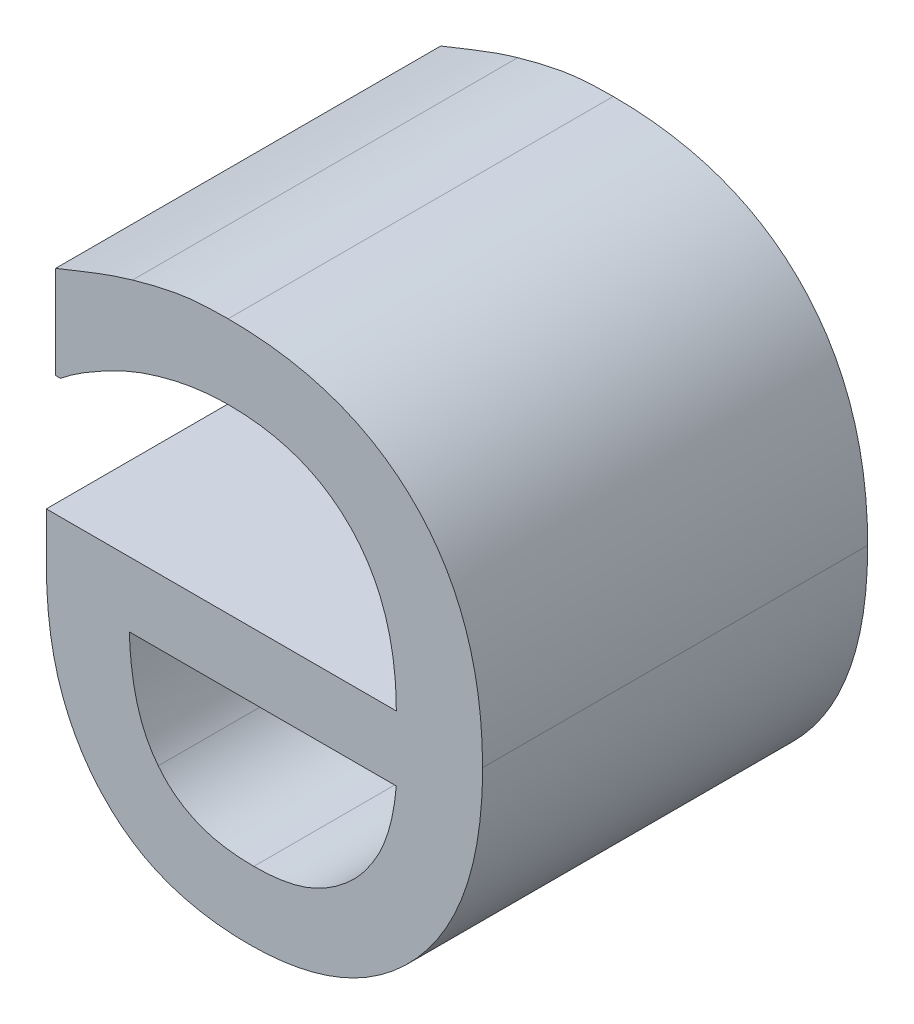
ISO-10303-21;
HEADER;
FILE_DESCRIPTION(('STEP AP214'),'2;1');
FILE_NAME('part.step','',(''),(''),'','','');
FILE_SCHEMA(('AUTOMOTIVE_DESIGN { 1 0 10303 214 1 1 1 1 }'));
ENDSEC;
DATA;
#1=APPLICATION_CONTEXT('core data for automotive mechanical design processes');
#2=APPLICATION_PROTOCOL_DEFINITION('international standard','automotive_design',2000,#1);
#3=PRODUCT_CONTEXT('',#1,'mechanical');
#4=PRODUCT('Part','Part','',(#3));
#5=PRODUCT_RELATED_PRODUCT_CATEGORY('part','',(#4));
#6=PRODUCT_DEFINITION_FORMATION('','',#4);
#7=PRODUCT_DEFINITION_CONTEXT('part definition',#1,'design');
#8=PRODUCT_DEFINITION('design','',#6,#7);
#9=PRODUCT_DEFINITION_SHAPE('','',#8);
#10=(LENGTH_UNIT() NAMED_UNIT(*) SI_UNIT(.MILLI.,.METRE.));
#11=(NAMED_UNIT(*) PLANE_ANGLE_UNIT() SI_UNIT($,.RADIAN.));
#12=(NAMED_UNIT(*) SI_UNIT($,.STERADIAN.) SOLID_ANGLE_UNIT());
#13=UNCERTAINTY_MEASURE_WITH_UNIT(LENGTH_MEASURE(1.E-05),#10,'distance_accuracy_value','');
#14=(GEOMETRIC_REPRESENTATION_CONTEXT(3) GLOBAL_UNCERTAINTY_ASSIGNED_CONTEXT((#13)) GLOBAL_UNIT_ASSIGNED_CONTEXT((#10,
#11,#12)) REPRESENTATION_CONTEXT('',''));
#15=CARTESIAN_POINT('',(0.,0.,0.));
#16=DIRECTION('',(0.,0.,1.));
#17=DIRECTION('',(1.,0.,0.));
#18=AXIS2_PLACEMENT_3D('',#15,#16,#17);
#19=CARTESIAN_POINT('',(6.0650370132147,1.5738883597151,0.));
#20=DIRECTION('',(0.,1.,0.));
#21=DIRECTION('',(-1.,0.,0.));
#22=AXIS2_PLACEMENT_3D('',#19,#20,#21);
#23=PLANE('',#22);
#24=DIRECTION('',(-1.,0.,0.));
#25=VECTOR('',#24,1.);
#26=CARTESIAN_POINT('',(6.0465221331064,1.5738883597151,0.));
#27=LINE('',#26,#25);
#28=CARTESIAN_POINT('',(6.0650370132147,1.5738883597151,0.));
#29=VERTEX_POINT('',#28);
#30=CARTESIAN_POINT('',(5.995705210322,1.5738883597151,0.));
#31=VERTEX_POINT('',#30);
#32=EDGE_CURVE('E11',#29,#31,#27,.T.);
#33=ORIENTED_EDGE('',*,*,#32,.F.);
#34=DIRECTION('',(0.,0.,1.));
#35=VECTOR('',#34,1.);
#36=CARTESIAN_POINT('',(6.0650370132147,1.5738883597151,0.));
#37=LINE('',#36,#35);
#38=CARTESIAN_POINT('',(6.0650370132147,1.5738883597151,0.1));
#39=VERTEX_POINT('',#38);
#40=EDGE_CURVE('E24',#29,#39,#37,.T.);
#41=ORIENTED_EDGE('',*,*,#40,.T.);
#42=DIRECTION('',(1.,0.,0.));
#43=VECTOR('',#42,1.);
#44=CARTESIAN_POINT('',(6.0465221331064,1.5738883597151,0.1));
#45=LINE('',#44,#43);
#46=CARTESIAN_POINT('',(5.995705210322,1.5738883597151,0.1));
#47=VERTEX_POINT('',#46);
#48=EDGE_CURVE('E414',#47,#39,#45,.T.);
#49=ORIENTED_EDGE('',*,*,#48,.F.);
#50=DIRECTION('',(0.,0.,1.));
#51=VECTOR('',#50,1.);
#52=CARTESIAN_POINT('',(5.995705210322,1.5738883597151,0.));
#53=LINE('',#52,#51);
#54=EDGE_CURVE('E408',#31,#47,#53,.T.);
#55=ORIENTED_EDGE('',*,*,#54,.F.);
#56=EDGE_LOOP('',(#33,#41,#49,#55));
#57=FACE_BOUND('',#56,.T.);
#58=ADVANCED_FACE('F17',(#57),#23,.F.);
#59=CARTESIAN_POINT('',(6.0542615182866,1.5476585365349,0.));
#60=CARTESIAN_POINT('',(6.0542615182866,1.5476585365349,0.1));
#61=CARTESIAN_POINT('',(6.0592239172666,1.5529045011709,0.));
#62=CARTESIAN_POINT('',(6.0592239172666,1.5529045011709,0.1));
#63=CARTESIAN_POINT('',(6.0643280990747,1.565523172863,0.));
#64=CARTESIAN_POINT('',(6.0643280990747,1.565523172863,0.1));
#65=CARTESIAN_POINT('',(6.0650370132147,1.5738883597151,0.));
#66=CARTESIAN_POINT('',(6.0650370132147,1.5738883597151,0.1));
#67=B_SPLINE_SURFACE_WITH_KNOTS('',2,1,((#59,#60),(#61,#62),(#63,#64),(#65,#66)),.UNSPECIFIED.,
.F.,.F.,.F.,(3,1,3),(2,2),(0.,1.,2.),(0.,0.01),.UNSPECIFIED.);
#68=CARTESIAN_POINT('',(6.0542615182866,1.5476585365349,0.));
#69=CARTESIAN_POINT('',(6.0592239172666,1.5529045011709,0.));
#70=CARTESIAN_POINT('',(6.0643280990747,1.565523172863,0.));
#71=CARTESIAN_POINT('',(6.0650370132147,1.5738883597151,0.));
#72=B_SPLINE_CURVE_WITH_KNOTS('',2,(#68,#69,#70,#71),.UNSPECIFIED.,.F.,.F.,(3,1,3),(0.,1.,2.),.UNSPECIFIED.);
#73=CARTESIAN_POINT('',(6.0542615182866,1.5476585365349,0.));
#74=VERTEX_POINT('',#73);
#75=EDGE_CURVE('E404',#74,#29,#72,.T.);
#76=DIRECTION('',(0.,0.,1.));
#77=VECTOR('',#76,1.);
#78=CARTESIAN_POINT('',(6.0542615182866,1.5476585365349,0.));
#79=LINE('',#78,#77);
#80=CARTESIAN_POINT('',(6.0542615182866,1.5476585365349,0.1));
#81=VERTEX_POINT('',#80);
#82=EDGE_CURVE('E398',#74,#81,#79,.T.);
#83=CARTESIAN_POINT('',(6.0650370132147,1.5738883597151,0.1));
#84=CARTESIAN_POINT('',(6.0643280990747,1.565523172863,0.1));
#85=CARTESIAN_POINT('',(6.0592239172666,1.5529045011709,0.1));
#86=CARTESIAN_POINT('',(6.0542615182866,1.5476585365349,0.1));
#87=B_SPLINE_CURVE_WITH_KNOTS('',2,(#83,#84,#85,#86),.UNSPECIFIED.,.F.,.F.,(3,1,3),(-2.,-1.,0.),.UNSPECIFIED.);
#88=EDGE_CURVE('E391',#39,#81,#87,.T.);
#89=ORIENTED_EDGE('',*,*,#75,.F.);
#90=ORIENTED_EDGE('',*,*,#82,.T.);
#91=ORIENTED_EDGE('',*,*,#88,.F.);
#92=ORIENTED_EDGE('',*,*,#40,.F.);
#93=EDGE_LOOP('',(#89,#90,#91,#92));
#94=FACE_BOUND('',#93,.T.);
#95=ADVANCED_FACE('F420',(#94),#67,.F.);
#96=CARTESIAN_POINT('',(6.0280316951063,1.5373083900908,0.));
#97=CARTESIAN_POINT('',(6.0280316951063,1.5373083900908,0.1));
#98=CARTESIAN_POINT('',(6.0368222304424,1.5373083900908,0.));
#99=CARTESIAN_POINT('',(6.0368222304424,1.5373083900908,0.1));
#100=CARTESIAN_POINT('',(6.0491573364785,1.5425543547268,0.));
#101=CARTESIAN_POINT('',(6.0491573364785,1.5425543547268,0.1));
#102=CARTESIAN_POINT('',(6.0542615182866,1.5476585365349,0.));
#103=CARTESIAN_POINT('',(6.0542615182866,1.5476585365349,0.1));
#104=B_SPLINE_SURFACE_WITH_KNOTS('',2,1,((#96,#97),(#98,#99),(#100,#101),(#102,#103)),
.UNSPECIFIED.,.F.,.F.,.F.,(3,1,3),(2,2),(0.,1.,2.),(0.,0.01),.UNSPECIFIED.);
#105=CARTESIAN_POINT('',(6.0280316951063,1.5373083900908,0.));
#106=CARTESIAN_POINT('',(6.0368222304424,1.5373083900908,0.));
#107=CARTESIAN_POINT('',(6.0491573364785,1.5425543547268,0.));
#108=CARTESIAN_POINT('',(6.0542615182866,1.5476585365349,0.));
#109=B_SPLINE_CURVE_WITH_KNOTS('',2,(#105,#106,#107,#108),.UNSPECIFIED.,.F.,.F.,(3,1,3),(0.,1.,
2.),.UNSPECIFIED.);
#110=CARTESIAN_POINT('',(6.0280316951063,1.5373083900908,0.));
#111=VERTEX_POINT('',#110);
#112=EDGE_CURVE('E386',#111,#74,#109,.T.);
#113=DIRECTION('',(0.,0.,1.));
#114=VECTOR('',#113,1.);
#115=CARTESIAN_POINT('',(6.0280316951063,1.5373083900908,0.));
#116=LINE('',#115,#114);
#117=CARTESIAN_POINT('',(6.0280316951063,1.5373083900908,0.1));
#118=VERTEX_POINT('',#117);
#119=EDGE_CURVE('E380',#111,#118,#116,.T.);
#120=CARTESIAN_POINT('',(6.0542615182866,1.5476585365349,0.1));
#121=CARTESIAN_POINT('',(6.0491573364785,1.5425543547268,0.1));
#122=CARTESIAN_POINT('',(6.0368222304424,1.5373083900908,0.1));
#123=CARTESIAN_POINT('',(6.0280316951063,1.5373083900908,0.1));
#124=B_SPLINE_CURVE_WITH_KNOTS('',2,(#120,#121,#122,#123),.UNSPECIFIED.,.F.,.F.,(3,1,3),(-2.,
-1.,0.),.UNSPECIFIED.);
#125=EDGE_CURVE('E373',#81,#118,#124,.T.);
#126=ORIENTED_EDGE('',*,*,#112,.F.);
#127=ORIENTED_EDGE('',*,*,#119,.T.);
#128=ORIENTED_EDGE('',*,*,#125,.F.);
#129=ORIENTED_EDGE('',*,*,#82,.F.);
#130=EDGE_LOOP('',(#126,#127,#128,#129));
#131=FACE_BOUND('',#130,.T.);
#132=ADVANCED_FACE('F424',(#131),#104,.F.);
#133=CARTESIAN_POINT('',(6.0032197002061,1.5475167537068,0.));
#134=CARTESIAN_POINT('',(6.0032197002061,1.5475167537068,0.1));
#135=CARTESIAN_POINT('',(6.0070478365621,1.5425543547268,0.));
#136=CARTESIAN_POINT('',(6.0070478365621,1.5425543547268,0.1));
#137=CARTESIAN_POINT('',(6.0190993769422,1.5373083900908,0.));
#138=CARTESIAN_POINT('',(6.0190993769422,1.5373083900908,0.1));
#139=CARTESIAN_POINT('',(6.0280316951063,1.5373083900908,0.));
#140=CARTESIAN_POINT('',(6.0280316951063,1.5373083900908,0.1));
#141=B_SPLINE_SURFACE_WITH_KNOTS('',2,1,((#133,#134),(#135,#136),(#137,#138),(#139,#140)),
.UNSPECIFIED.,.F.,.F.,.F.,(3,1,3),(2,2),(0.,1.,2.),(0.,0.01),.UNSPECIFIED.);
#142=CARTESIAN_POINT('',(6.0032197002061,1.5475167537068,0.));
#143=CARTESIAN_POINT('',(6.0070478365621,1.5425543547268,0.));
#144=CARTESIAN_POINT('',(6.0190993769422,1.5373083900908,0.));
#145=CARTESIAN_POINT('',(6.0280316951063,1.5373083900908,0.));
#146=B_SPLINE_CURVE_WITH_KNOTS('',2,(#142,#143,#144,#145),.UNSPECIFIED.,.F.,.F.,(3,1,3),(0.,1.,
2.),.UNSPECIFIED.);
#147=CARTESIAN_POINT('',(6.0032197002061,1.5475167537068,0.));
#148=VERTEX_POINT('',#147);
#149=EDGE_CURVE('E368',#148,#111,#146,.T.);
#150=DIRECTION('',(0.,0.,1.));
#151=VECTOR('',#150,1.);
#152=CARTESIAN_POINT('',(6.0032197002061,1.5475167537068,0.));
#153=LINE('',#152,#151);
#154=CARTESIAN_POINT('',(6.0032197002061,1.5475167537068,0.1));
#155=VERTEX_POINT('',#154);
#156=EDGE_CURVE('E362',#148,#155,#153,.T.);
#157=CARTESIAN_POINT('',(6.0280316951063,1.5373083900908,0.1));
#158=CARTESIAN_POINT('',(6.0190993769422,1.5373083900908,0.1));
#159=CARTESIAN_POINT('',(6.0070478365621,1.5425543547268,0.1));
#160=CARTESIAN_POINT('',(6.0032197002061,1.5475167537068,0.1));
#161=B_SPLINE_CURVE_WITH_KNOTS('',2,(#157,#158,#159,#160),.UNSPECIFIED.,.F.,.F.,(3,1,3),(-2.,
-1.,0.),.UNSPECIFIED.);
#162=EDGE_CURVE('E355',#118,#155,#161,.T.);
#163=ORIENTED_EDGE('',*,*,#149,.F.);
#164=ORIENTED_EDGE('',*,*,#156,.T.);
#165=ORIENTED_EDGE('',*,*,#162,.F.);
#166=ORIENTED_EDGE('',*,*,#119,.F.);
#167=EDGE_LOOP('',(#163,#164,#165,#166));
#168=FACE_BOUND('',#167,.T.);
#169=ADVANCED_FACE('F428',(#168),#141,.F.);
#170=CARTESIAN_POINT('',(5.995705210322,1.5738883597151,0.));
#171=CARTESIAN_POINT('',(5.995705210322,1.5738883597151,0.1));
#172=CARTESIAN_POINT('',(5.995988775978,1.564956041551,0.));
#173=CARTESIAN_POINT('',(5.995988775978,1.564956041551,0.1));
#174=CARTESIAN_POINT('',(5.999675129506,1.5519120213749,0.));
#175=CARTESIAN_POINT('',(5.999675129506,1.5519120213749,0.1));
#176=CARTESIAN_POINT('',(6.0032197002061,1.5475167537068,0.));
#177=CARTESIAN_POINT('',(6.0032197002061,1.5475167537068,0.1));
#178=B_SPLINE_SURFACE_WITH_KNOTS('',2,1,((#170,#171),(#172,#173),(#174,#175),(#176,#177)),
.UNSPECIFIED.,.F.,.F.,.F.,(3,1,3),(2,2),(0.,1.,2.),(0.,0.01),.UNSPECIFIED.);
#179=CARTESIAN_POINT('',(5.995705210322,1.5738883597151,0.));
#180=CARTESIAN_POINT('',(5.995988775978,1.564956041551,0.));
#181=CARTESIAN_POINT('',(5.999675129506,1.5519120213749,0.));
#182=CARTESIAN_POINT('',(6.0032197002061,1.5475167537068,0.));
#183=B_SPLINE_CURVE_WITH_KNOTS('',2,(#179,#180,#181,#182),.UNSPECIFIED.,.F.,.F.,(3,1,3),(0.,1.,
2.),.UNSPECIFIED.);
#184=EDGE_CURVE('E348',#31,#148,#183,.T.);
#185=CARTESIAN_POINT('',(6.0032197002061,1.5475167537068,0.1));
#186=CARTESIAN_POINT('',(5.999675129506,1.5519120213749,0.1));
#187=CARTESIAN_POINT('',(5.995988775978,1.564956041551,0.1));
#188=CARTESIAN_POINT('',(5.995705210322,1.5738883597151,0.1));
#189=B_SPLINE_CURVE_WITH_KNOTS('',2,(#185,#186,#187,#188),.UNSPECIFIED.,.F.,.F.,(3,1,3),(-2.,
-1.,0.),.UNSPECIFIED.);
#190=EDGE_CURVE('E340',#155,#47,#189,.T.);
#191=ORIENTED_EDGE('',*,*,#184,.F.);
#192=ORIENTED_EDGE('',*,*,#54,.T.);
#193=ORIENTED_EDGE('',*,*,#190,.F.);
#194=ORIENTED_EDGE('',*,*,#156,.F.);
#195=EDGE_LOOP('',(#191,#192,#193,#194));
#196=FACE_BOUND('',#195,.T.);
#197=ADVANCED_FACE('F431',(#196),#178,.F.);
#198=CARTESIAN_POINT('',(6.0267556496543,1.5191601881066,0.));
#199=CARTESIAN_POINT('',(6.0267556496543,1.5191601881066,0.1));
#200=CARTESIAN_POINT('',(6.0538361698026,1.5191601881066,0.));
#201=CARTESIAN_POINT('',(6.0538361698026,1.5191601881066,0.1));
#202=CARTESIAN_POINT('',(6.0874387000389,1.5571579860109,0.));
#203=CARTESIAN_POINT('',(6.0874387000389,1.5571579860109,0.1));
#204=CARTESIAN_POINT('',(6.0874387000389,1.5892009051393,0.));
#205=CARTESIAN_POINT('',(6.0874387000389,1.5892009051393,0.1));
#206=B_SPLINE_SURFACE_WITH_KNOTS('',2,1,((#198,#199),(#200,#201),(#202,#203),(#204,#205)),
.UNSPECIFIED.,.F.,.F.,.F.,(3,1,3),(2,2),(-2.,-1.,0.),(0.,0.01),.UNSPECIFIED.);
#207=CARTESIAN_POINT('',(6.0874387000389,1.5892009051393,0.));
#208=CARTESIAN_POINT('',(6.0874387000389,1.5571579860109,0.));
#209=CARTESIAN_POINT('',(6.0538361698026,1.5191601881066,0.));
#210=CARTESIAN_POINT('',(6.0267556496543,1.5191601881066,0.));
#211=B_SPLINE_CURVE_WITH_KNOTS('',2,(#207,#208,#209,#210),.UNSPECIFIED.,.F.,.F.,(3,1,3),(0.,1.,
2.),.UNSPECIFIED.);
#212=CARTESIAN_POINT('',(6.0874387000389,1.5892009051393,0.));
#213=VERTEX_POINT('',#212);
#214=CARTESIAN_POINT('',(6.0267556496543,1.5191601881066,0.));
#215=VERTEX_POINT('',#214);
#216=EDGE_CURVE('E336',#213,#215,#211,.T.);
#217=DIRECTION('',(0.,0.,1.));
#218=VECTOR('',#217,1.);
#219=CARTESIAN_POINT('',(6.0874387000389,1.5892009051393,0.));
#220=LINE('',#219,#218);
#221=CARTESIAN_POINT('',(6.0874387000389,1.5892009051393,0.1));
#222=VERTEX_POINT('',#221);
#223=EDGE_CURVE('E331',#213,#222,#220,.T.);
#224=CARTESIAN_POINT('',(6.0267556496543,1.5191601881066,0.1));
#225=CARTESIAN_POINT('',(6.0538361698026,1.5191601881066,0.1));
#226=CARTESIAN_POINT('',(6.0874387000389,1.5571579860109,0.1));
#227=CARTESIAN_POINT('',(6.0874387000389,1.5892009051393,0.1));
#228=B_SPLINE_CURVE_WITH_KNOTS('',2,(#224,#225,#226,#227),.UNSPECIFIED.,.F.,.F.,(3,1,3),(-2.,
-1.,0.),.UNSPECIFIED.);
#229=CARTESIAN_POINT('',(6.0267556496543,1.5191601881066,0.1));
#230=VERTEX_POINT('',#229);
#231=EDGE_CURVE('E164',#230,#222,#228,.T.);
#232=DIRECTION('',(0.,0.,1.));
#233=VECTOR('',#232,1.);
#234=CARTESIAN_POINT('',(6.0267556496543,1.5191601881066,0.));
#235=LINE('',#234,#233);
#236=EDGE_CURVE('E322',#215,#230,#235,.T.);
#237=ORIENTED_EDGE('',*,*,#216,.F.);
#238=ORIENTED_EDGE('',*,*,#223,.T.);
#239=ORIENTED_EDGE('',*,*,#231,.F.);
#240=ORIENTED_EDGE('',*,*,#236,.F.);
#241=EDGE_LOOP('',(#237,#238,#239,#240));
#242=FACE_BOUND('',#241,.T.);
#243=ADVANCED_FACE('F479',(#242),#206,.T.);
#244=CARTESIAN_POINT('',(5.9887578517499,1.5337638193907,0.));
#245=CARTESIAN_POINT('',(5.9887578517499,1.5337638193907,0.1));
#246=CARTESIAN_POINT('',(5.995705210322,1.5262493295066,0.));
#247=CARTESIAN_POINT('',(5.995705210322,1.5262493295066,0.1));
#248=CARTESIAN_POINT('',(6.0145623264462,1.5191601881066,0.));
#249=CARTESIAN_POINT('',(6.0145623264462,1.5191601881066,0.1));
#250=CARTESIAN_POINT('',(6.0267556496543,1.5191601881066,0.));
#251=CARTESIAN_POINT('',(6.0267556496543,1.5191601881066,0.1));
#252=B_SPLINE_SURFACE_WITH_KNOTS('',2,1,((#244,#245),(#246,#247),(#248,#249),(#250,#251)),
.UNSPECIFIED.,.F.,.F.,.F.,(3,1,3),(2,2),(-2.,-1.,0.),(0.,0.01),.UNSPECIFIED.);
#253=CARTESIAN_POINT('',(6.0267556496543,1.5191601881066,0.));
#254=CARTESIAN_POINT('',(6.0145623264462,1.5191601881066,0.));
#255=CARTESIAN_POINT('',(5.995705210322,1.5262493295066,0.));
#256=CARTESIAN_POINT('',(5.9887578517499,1.5337638193907,0.));
#257=B_SPLINE_CURVE_WITH_KNOTS('',2,(#253,#254,#255,#256),.UNSPECIFIED.,.F.,.F.,(3,1,3),(0.,1.,
2.),.UNSPECIFIED.);
#258=CARTESIAN_POINT('',(5.9887578517499,1.5337638193907,0.));
#259=VERTEX_POINT('',#258);
#260=EDGE_CURVE('E315',#215,#259,#257,.T.);
#261=CARTESIAN_POINT('',(5.9887578517499,1.5337638193907,0.1));
#262=CARTESIAN_POINT('',(5.995705210322,1.5262493295066,0.1));
#263=CARTESIAN_POINT('',(6.0145623264462,1.5191601881066,0.1));
#264=CARTESIAN_POINT('',(6.0267556496543,1.5191601881066,0.1));
#265=B_SPLINE_CURVE_WITH_KNOTS('',2,(#261,#262,#263,#264),.UNSPECIFIED.,.F.,.F.,(3,1,3),(-2.,
-1.,0.),.UNSPECIFIED.);
#266=CARTESIAN_POINT('',(5.9887578517499,1.5337638193907,0.1));
#267=VERTEX_POINT('',#266);
#268=EDGE_CURVE('E311',#267,#230,#265,.T.);
#269=DIRECTION('',(0.,0.,1.));
#270=VECTOR('',#269,1.);
#271=CARTESIAN_POINT('',(5.9887578517499,1.5337638193907,0.));
#272=LINE('',#271,#270);
#273=EDGE_CURVE('E305',#259,#267,#272,.T.);
#274=ORIENTED_EDGE('',*,*,#260,.F.);
#275=ORIENTED_EDGE('',*,*,#236,.T.);
#276=ORIENTED_EDGE('',*,*,#268,.F.);
#277=ORIENTED_EDGE('',*,*,#273,.F.);
#278=EDGE_LOOP('',(#274,#275,#276,#277));
#279=FACE_BOUND('',#278,.T.);
#280=ADVANCED_FACE('F489',(#279),#252,.T.);
#281=CARTESIAN_POINT('',(5.9741542204658,1.5787089758672,0.));
#282=CARTESIAN_POINT('',(5.9741542204658,1.5787089758672,0.1));
#283=CARTESIAN_POINT('',(5.9741542204658,1.562971081959,0.));
#284=CARTESIAN_POINT('',(5.9741542204658,1.562971081959,0.1));
#285=CARTESIAN_POINT('',(5.9816687103499,1.5412783092748,0.));
#286=CARTESIAN_POINT('',(5.9816687103499,1.5412783092748,0.1));
#287=CARTESIAN_POINT('',(5.9887578517499,1.5337638193907,0.));
#288=CARTESIAN_POINT('',(5.9887578517499,1.5337638193907,0.1));
#289=B_SPLINE_SURFACE_WITH_KNOTS('',2,1,((#281,#282),(#283,#284),(#285,#286),(#287,#288)),
.UNSPECIFIED.,.F.,.F.,.F.,(3,1,3),(2,2),(-2.,-1.,0.),(0.,0.01),.UNSPECIFIED.);
#290=CARTESIAN_POINT('',(5.9887578517499,1.5337638193907,0.));
#291=CARTESIAN_POINT('',(5.9816687103499,1.5412783092748,0.));
#292=CARTESIAN_POINT('',(5.9741542204658,1.562971081959,0.));
#293=CARTESIAN_POINT('',(5.9741542204658,1.5787089758672,0.));
#294=B_SPLINE_CURVE_WITH_KNOTS('',2,(#290,#291,#292,#293),.UNSPECIFIED.,.F.,.F.,(3,1,3),(0.,1.,
2.),.UNSPECIFIED.);
#295=CARTESIAN_POINT('',(5.9741542204658,1.5787089758672,0.));
#296=VERTEX_POINT('',#295);
#297=EDGE_CURVE('E298',#259,#296,#294,.T.);
#298=CARTESIAN_POINT('',(5.9741542204658,1.5787089758672,0.1));
#299=CARTESIAN_POINT('',(5.9741542204658,1.562971081959,0.1));
#300=CARTESIAN_POINT('',(5.9816687103499,1.5412783092748,0.1));
#301=CARTESIAN_POINT('',(5.9887578517499,1.5337638193907,0.1));
#302=B_SPLINE_CURVE_WITH_KNOTS('',2,(#298,#299,#300,#301),.UNSPECIFIED.,.F.,.F.,(3,1,3),(-2.,
-1.,0.),.UNSPECIFIED.);
#303=CARTESIAN_POINT('',(5.9741542204658,1.5787089758672,0.1));
#304=VERTEX_POINT('',#303);
#305=EDGE_CURVE('E293',#304,#267,#302,.T.);
#306=DIRECTION('',(0.,0.,1.));
#307=VECTOR('',#306,1.);
#308=CARTESIAN_POINT('',(5.9741542204658,1.5787089758672,0.));
#309=LINE('',#308,#307);
#310=EDGE_CURVE('E290',#296,#304,#309,.T.);
#311=ORIENTED_EDGE('',*,*,#297,.F.);
#312=ORIENTED_EDGE('',*,*,#273,.T.);
#313=ORIENTED_EDGE('',*,*,#305,.F.);
#314=ORIENTED_EDGE('',*,*,#310,.F.);
#315=EDGE_LOOP('',(#311,#312,#313,#314));
#316=FACE_BOUND('',#315,.T.);
#317=ADVANCED_FACE('F500',(#316),#289,.T.);
#318=CARTESIAN_POINT('',(5.9741542204658,1.5907605162473,0.));
#319=DIRECTION('',(-1.,0.,0.));
#320=DIRECTION('',(0.,-1.,0.));
#321=AXIS2_PLACEMENT_3D('',#318,#319,#320);
#322=PLANE('',#321);
#323=DIRECTION('',(0.,1.,0.));
#324=VECTOR('',#323,1.);
#325=CARTESIAN_POINT('',(5.9741542204658,1.5787089758672,0.));
#326=LINE('',#325,#324);
#327=CARTESIAN_POINT('',(5.9741542204658,1.5907605162473,0.));
#328=VERTEX_POINT('',#327);
#329=EDGE_CURVE('E288',#296,#328,#326,.T.);
#330=ORIENTED_EDGE('',*,*,#329,.F.);
#331=ORIENTED_EDGE('',*,*,#310,.T.);
#332=DIRECTION('',(0.,-1.,0.));
#333=VECTOR('',#332,1.);
#334=CARTESIAN_POINT('',(5.9741542204658,1.5787089758672,0.1));
#335=LINE('',#334,#333);
#336=CARTESIAN_POINT('',(5.9741542204658,1.5907605162473,0.1));
#337=VERTEX_POINT('',#336);
#338=EDGE_CURVE('E285',#337,#304,#335,.T.);
#339=ORIENTED_EDGE('',*,*,#338,.F.);
#340=DIRECTION('',(0.,0.,1.));
#341=VECTOR('',#340,1.);
#342=CARTESIAN_POINT('',(5.9741542204658,1.5907605162473,0.));
#343=LINE('',#342,#341);
#344=EDGE_CURVE('E282',#328,#337,#343,.T.);
#345=ORIENTED_EDGE('',*,*,#344,.F.);
#346=EDGE_LOOP('',(#330,#331,#339,#345));
#347=FACE_BOUND('',#346,.T.);
#348=ADVANCED_FACE('F511',(#347),#322,.T.);
#349=CARTESIAN_POINT('',(6.0650370132147,1.5907605162473,0.));
#350=DIRECTION('',(0.,1.,0.));
#351=DIRECTION('',(-1.,0.,0.));
#352=AXIS2_PLACEMENT_3D('',#349,#350,#351);
#353=PLANE('',#352);
#354=DIRECTION('',(1.,0.,0.));
#355=VECTOR('',#354,1.);
#356=CARTESIAN_POINT('',(5.9741542204658,1.5907605162473,0.));
#357=LINE('',#356,#355);
#358=CARTESIAN_POINT('',(6.0650370132147,1.5907605162473,0.));
#359=VERTEX_POINT('',#358);
#360=EDGE_CURVE('E280',#328,#359,#357,.T.);
#361=ORIENTED_EDGE('',*,*,#360,.F.);
#362=ORIENTED_EDGE('',*,*,#344,.T.);
#363=DIRECTION('',(-1.,0.,0.));
#364=VECTOR('',#363,1.);
#365=CARTESIAN_POINT('',(5.9741542204658,1.5907605162473,0.1));
#366=LINE('',#365,#364);
#367=CARTESIAN_POINT('',(6.0650370132147,1.5907605162473,0.1));
#368=VERTEX_POINT('',#367);
#369=EDGE_CURVE('E277',#368,#337,#366,.T.);
#370=ORIENTED_EDGE('',*,*,#369,.F.);
#371=DIRECTION('',(0.,0.,1.));
#372=VECTOR('',#371,1.);
#373=CARTESIAN_POINT('',(6.0650370132147,1.5907605162473,0.));
#374=LINE('',#373,#372);
#375=EDGE_CURVE('E271',#359,#368,#374,.T.);
#376=ORIENTED_EDGE('',*,*,#375,.F.);
#377=EDGE_LOOP('',(#361,#362,#370,#376));
#378=FACE_BOUND('',#377,.T.);
#379=ADVANCED_FACE('F520',(#378),#353,.T.);
#380=CARTESIAN_POINT('',(6.0216514678463,1.6378324151437,0.));
#381=CARTESIAN_POINT('',(6.0216514678463,1.6378324151437,0.1));
#382=CARTESIAN_POINT('',(6.0420681950785,1.6378324151437,0.));
#383=CARTESIAN_POINT('',(6.0420681950785,1.6378324151437,0.1));
#384=CARTESIAN_POINT('',(6.0650370132147,1.6135875515555,0.));
#385=CARTESIAN_POINT('',(6.0650370132147,1.6135875515555,0.1));
#386=CARTESIAN_POINT('',(6.0650370132147,1.5907605162473,0.));
#387=CARTESIAN_POINT('',(6.0650370132147,1.5907605162473,0.1));
#388=B_SPLINE_SURFACE_WITH_KNOTS('',2,1,((#380,#381),(#382,#383),(#384,#385),(#386,#387)),
.UNSPECIFIED.,.F.,.F.,.F.,(3,1,3),(2,2),(-2.,-1.,0.),(0.,0.01),.UNSPECIFIED.);
#389=CARTESIAN_POINT('',(6.0650370132147,1.5907605162473,0.));
#390=CARTESIAN_POINT('',(6.0650370132147,1.6135875515555,0.));
#391=CARTESIAN_POINT('',(6.0420681950785,1.6378324151437,0.));
#392=CARTESIAN_POINT('',(6.0216514678463,1.6378324151437,0.));
#393=B_SPLINE_CURVE_WITH_KNOTS('',2,(#389,#390,#391,#392),.UNSPECIFIED.,.F.,.F.,(3,1,3),(0.,1.,
2.),.UNSPECIFIED.);
#394=CARTESIAN_POINT('',(6.0216514678463,1.6378324151437,0.));
#395=VERTEX_POINT('',#394);
#396=EDGE_CURVE('E264',#359,#395,#393,.T.);
#397=CARTESIAN_POINT('',(6.0216514678463,1.6378324151437,0.1));
#398=CARTESIAN_POINT('',(6.0420681950785,1.6378324151437,0.1));
#399=CARTESIAN_POINT('',(6.0650370132147,1.6135875515555,0.1));
#400=CARTESIAN_POINT('',(6.0650370132147,1.5907605162473,0.1));
#401=B_SPLINE_CURVE_WITH_KNOTS('',2,(#397,#398,#399,#400),.UNSPECIFIED.,.F.,.F.,(3,1,3),(-2.,
-1.,0.),.UNSPECIFIED.);
#402=CARTESIAN_POINT('',(6.0216514678463,1.6378324151437,0.1));
#403=VERTEX_POINT('',#402);
#404=EDGE_CURVE('E259',#403,#368,#401,.T.);
#405=DIRECTION('',(0.,0.,1.));
#406=VECTOR('',#405,1.);
#407=CARTESIAN_POINT('',(6.0216514678463,1.6378324151437,0.));
#408=LINE('',#407,#406);
#409=EDGE_CURVE('E253',#395,#403,#408,.T.);
#410=ORIENTED_EDGE('',*,*,#396,.F.);
#411=ORIENTED_EDGE('',*,*,#375,.T.);
#412=ORIENTED_EDGE('',*,*,#404,.F.);
#413=ORIENTED_EDGE('',*,*,#409,.F.);
#414=EDGE_LOOP('',(#410,#411,#412,#413));
#415=FACE_BOUND('',#414,.T.);
#416=ADVANCED_FACE('F524',(#415),#388,.T.);
#417=CARTESIAN_POINT('',(5.994712730526,1.6320193191957,0.));
#418=CARTESIAN_POINT('',(5.994712730526,1.6320193191957,0.1));
#419=CARTESIAN_POINT('',(6.000384043646,1.6345714100997,0.));
#420=CARTESIAN_POINT('',(6.000384043646,1.6345714100997,0.1));
#421=CARTESIAN_POINT('',(6.0144205436182,1.6378324151437,0.));
#422=CARTESIAN_POINT('',(6.0144205436182,1.6378324151437,0.1));
#423=CARTESIAN_POINT('',(6.0216514678463,1.6378324151437,0.));
#424=CARTESIAN_POINT('',(6.0216514678463,1.6378324151437,0.1));
#425=B_SPLINE_SURFACE_WITH_KNOTS('',2,1,((#417,#418),(#419,#420),(#421,#422),(#423,#424)),
.UNSPECIFIED.,.F.,.F.,.F.,(3,1,3),(2,2),(-2.,-1.,0.),(0.,0.01),.UNSPECIFIED.);
#426=CARTESIAN_POINT('',(6.0216514678463,1.6378324151437,0.));
#427=CARTESIAN_POINT('',(6.0144205436182,1.6378324151437,0.));
#428=CARTESIAN_POINT('',(6.000384043646,1.6345714100997,0.));
#429=CARTESIAN_POINT('',(5.994712730526,1.6320193191957,0.));
#430=B_SPLINE_CURVE_WITH_KNOTS('',2,(#426,#427,#428,#429),.UNSPECIFIED.,.F.,.F.,(3,1,3),(0.,1.,
2.),.UNSPECIFIED.);
#431=CARTESIAN_POINT('',(5.994712730526,1.6320193191957,0.));
#432=VERTEX_POINT('',#431);
#433=EDGE_CURVE('E246',#395,#432,#430,.T.);
#434=CARTESIAN_POINT('',(5.994712730526,1.6320193191957,0.1));
#435=CARTESIAN_POINT('',(6.000384043646,1.6345714100997,0.1));
#436=CARTESIAN_POINT('',(6.0144205436182,1.6378324151437,0.1));
#437=CARTESIAN_POINT('',(6.0216514678463,1.6378324151437,0.1));
#438=B_SPLINE_CURVE_WITH_KNOTS('',2,(#434,#435,#436,#437),.UNSPECIFIED.,.F.,.F.,(3,1,3),(-2.,
-1.,0.),.UNSPECIFIED.);
#439=CARTESIAN_POINT('',(5.994712730526,1.6320193191957,0.1));
#440=VERTEX_POINT('',#439);
#441=EDGE_CURVE('E241',#440,#403,#438,.T.);
#442=DIRECTION('',(0.,0.,1.));
#443=VECTOR('',#442,1.);
#444=CARTESIAN_POINT('',(5.994712730526,1.6320193191957,0.));
#445=LINE('',#444,#443);
#446=EDGE_CURVE('E235',#432,#440,#445,.T.);
#447=ORIENTED_EDGE('',*,*,#433,.F.);
#448=ORIENTED_EDGE('',*,*,#409,.T.);
#449=ORIENTED_EDGE('',*,*,#441,.F.);
#450=ORIENTED_EDGE('',*,*,#446,.F.);
#451=EDGE_LOOP('',(#447,#448,#449,#450));
#452=FACE_BOUND('',#451,.T.);
#453=ADVANCED_FACE('F530',(#452),#425,.T.);
#454=CARTESIAN_POINT('',(5.9778405739938,1.6219527384076,0.));
#455=CARTESIAN_POINT('',(5.9778405739938,1.6219527384076,0.1));
#456=CARTESIAN_POINT('',(5.9805344477259,1.6242212636556,0.));
#457=CARTESIAN_POINT('',(5.9805344477259,1.6242212636556,0.1));
#458=CARTESIAN_POINT('',(5.9887578517499,1.6291836626356,0.));
#459=CARTESIAN_POINT('',(5.9887578517499,1.6291836626356,0.1));
#460=CARTESIAN_POINT('',(5.994712730526,1.6320193191957,0.));
#461=CARTESIAN_POINT('',(5.994712730526,1.6320193191957,0.1));
#462=B_SPLINE_SURFACE_WITH_KNOTS('',2,1,((#454,#455),(#456,#457),(#458,#459),(#460,#461)),
.UNSPECIFIED.,.F.,.F.,.F.,(3,1,3),(2,2),(-2.,-1.,0.),(0.,0.01),.UNSPECIFIED.);
#463=CARTESIAN_POINT('',(5.994712730526,1.6320193191957,0.));
#464=CARTESIAN_POINT('',(5.9887578517499,1.6291836626356,0.));
#465=CARTESIAN_POINT('',(5.9805344477259,1.6242212636556,0.));
#466=CARTESIAN_POINT('',(5.9778405739938,1.6219527384076,0.));
#467=B_SPLINE_CURVE_WITH_KNOTS('',2,(#463,#464,#465,#466),.UNSPECIFIED.,.F.,.F.,(3,1,3),(0.,1.,
2.),.UNSPECIFIED.);
#468=CARTESIAN_POINT('',(5.9778405739938,1.6219527384076,0.));
#469=VERTEX_POINT('',#468);
#470=EDGE_CURVE('E228',#432,#469,#467,.T.);
#471=CARTESIAN_POINT('',(5.9778405739938,1.6219527384076,0.1));
#472=CARTESIAN_POINT('',(5.9805344477259,1.6242212636556,0.1));
#473=CARTESIAN_POINT('',(5.9887578517499,1.6291836626356,0.1));
#474=CARTESIAN_POINT('',(5.994712730526,1.6320193191957,0.1));
#475=B_SPLINE_CURVE_WITH_KNOTS('',2,(#471,#472,#473,#474),.UNSPECIFIED.,.F.,.F.,(3,1,3),(-2.,
-1.,0.),.UNSPECIFIED.);
#476=CARTESIAN_POINT('',(5.9778405739938,1.6219527384076,0.1));
#477=VERTEX_POINT('',#476);
#478=EDGE_CURVE('E223',#477,#440,#475,.T.);
#479=DIRECTION('',(0.,0.,1.));
#480=VECTOR('',#479,1.);
#481=CARTESIAN_POINT('',(5.9778405739938,1.6219527384076,0.));
#482=LINE('',#481,#480);
#483=EDGE_CURVE('E220',#469,#477,#482,.T.);
#484=ORIENTED_EDGE('',*,*,#470,.F.);
#485=ORIENTED_EDGE('',*,*,#446,.T.);
#486=ORIENTED_EDGE('',*,*,#478,.F.);
#487=ORIENTED_EDGE('',*,*,#483,.F.);
#488=EDGE_LOOP('',(#484,#485,#486,#487));
#489=FACE_BOUND('',#488,.T.);
#490=ADVANCED_FACE('F541',(#489),#462,.T.);
#491=CARTESIAN_POINT('',(5.9765645285418,1.6219527384076,0.));
#492=DIRECTION('',(0.,-1.,0.));
#493=DIRECTION('',(1.,0.,0.));
#494=AXIS2_PLACEMENT_3D('',#491,#492,#493);
#495=PLANE('',#494);
#496=DIRECTION('',(-1.,0.,0.));
#497=VECTOR('',#496,1.);
#498=CARTESIAN_POINT('',(5.9778405739938,1.6219527384076,0.));
#499=LINE('',#498,#497);
#500=CARTESIAN_POINT('',(5.9765645285418,1.6219527384076,0.));
#501=VERTEX_POINT('',#500);
#502=EDGE_CURVE('E218',#469,#501,#499,.T.);
#503=ORIENTED_EDGE('',*,*,#502,.F.);
#504=ORIENTED_EDGE('',*,*,#483,.T.);
#505=DIRECTION('',(1.,0.,0.));
#506=VECTOR('',#505,1.);
#507=CARTESIAN_POINT('',(5.9778405739938,1.6219527384076,0.1));
#508=LINE('',#507,#506);
#509=CARTESIAN_POINT('',(5.9765645285418,1.6219527384076,0.1));
#510=VERTEX_POINT('',#509);
#511=EDGE_CURVE('E215',#510,#477,#508,.T.);
#512=ORIENTED_EDGE('',*,*,#511,.F.);
#513=DIRECTION('',(0.,0.,1.));
#514=VECTOR('',#513,1.);
#515=CARTESIAN_POINT('',(5.9765645285418,1.6219527384076,0.));
#516=LINE('',#515,#514);
#517=EDGE_CURVE('E212',#501,#510,#516,.T.);
#518=ORIENTED_EDGE('',*,*,#517,.F.);
#519=EDGE_LOOP('',(#503,#504,#512,#518));
#520=FACE_BOUND('',#519,.T.);
#521=ADVANCED_FACE('F552',(#520),#495,.T.);
#522=CARTESIAN_POINT('',(5.9765645285418,1.6460558191678,0.));
#523=DIRECTION('',(-1.,0.,0.));
#524=DIRECTION('',(0.,-1.,0.));
#525=AXIS2_PLACEMENT_3D('',#522,#523,#524);
#526=PLANE('',#525);
#527=DIRECTION('',(0.,1.,0.));
#528=VECTOR('',#527,1.);
#529=CARTESIAN_POINT('',(5.9765645285418,1.6219527384076,0.));
#530=LINE('',#529,#528);
#531=CARTESIAN_POINT('',(5.9765645285418,1.6460558191678,0.));
#532=VERTEX_POINT('',#531);
#533=EDGE_CURVE('E210',#501,#532,#530,.T.);
#534=ORIENTED_EDGE('',*,*,#533,.F.);
#535=ORIENTED_EDGE('',*,*,#517,.T.);
#536=DIRECTION('',(0.,-1.,0.));
#537=VECTOR('',#536,1.);
#538=CARTESIAN_POINT('',(5.9765645285418,1.6219527384076,0.1));
#539=LINE('',#538,#537);
#540=CARTESIAN_POINT('',(5.9765645285418,1.6460558191678,0.1));
#541=VERTEX_POINT('',#540);
#542=EDGE_CURVE('E207',#541,#510,#539,.T.);
#543=ORIENTED_EDGE('',*,*,#542,.F.);
#544=DIRECTION('',(0.,0.,1.));
#545=VECTOR('',#544,1.);
#546=CARTESIAN_POINT('',(5.9765645285418,1.6460558191678,0.));
#547=LINE('',#546,#545);
#548=EDGE_CURVE('E201',#532,#541,#547,.T.);
#549=ORIENTED_EDGE('',*,*,#548,.F.);
#550=EDGE_LOOP('',(#534,#535,#543,#549));
#551=FACE_BOUND('',#550,.T.);
#552=ADVANCED_FACE('F561',(#551),#526,.T.);
#553=CARTESIAN_POINT('',(5.99655590729,1.6534285262239,0.));
#554=CARTESIAN_POINT('',(5.99655590729,1.6534285262239,0.1));
#555=CARTESIAN_POINT('',(5.992018856794,1.6521524807719,0.));
#556=CARTESIAN_POINT('',(5.992018856794,1.6521524807719,0.1));
#557=CARTESIAN_POINT('',(5.9803926648979,1.6476154302758,0.));
#558=CARTESIAN_POINT('',(5.9803926648979,1.6476154302758,0.1));
#559=CARTESIAN_POINT('',(5.9765645285418,1.6460558191678,0.));
#560=CARTESIAN_POINT('',(5.9765645285418,1.6460558191678,0.1));
#561=B_SPLINE_SURFACE_WITH_KNOTS('',2,1,((#553,#554),(#555,#556),(#557,#558),(#559,#560)),
.UNSPECIFIED.,.F.,.F.,.F.,(3,1,3),(2,2),(-2.,-1.,0.),(0.,0.01),.UNSPECIFIED.);
#562=CARTESIAN_POINT('',(5.9765645285418,1.6460558191678,0.));
#563=CARTESIAN_POINT('',(5.9803926648979,1.6476154302758,0.));
#564=CARTESIAN_POINT('',(5.992018856794,1.6521524807719,0.));
#565=CARTESIAN_POINT('',(5.99655590729,1.6534285262239,0.));
#566=B_SPLINE_CURVE_WITH_KNOTS('',2,(#562,#563,#564,#565),.UNSPECIFIED.,.F.,.F.,(3,1,3),(0.,1.,
2.),.UNSPECIFIED.);
#567=CARTESIAN_POINT('',(5.99655590729,1.6534285262239,0.));
#568=VERTEX_POINT('',#567);
#569=EDGE_CURVE('E194',#532,#568,#566,.T.);
#570=CARTESIAN_POINT('',(5.99655590729,1.6534285262239,0.1));
#571=CARTESIAN_POINT('',(5.992018856794,1.6521524807719,0.1));
#572=CARTESIAN_POINT('',(5.9803926648979,1.6476154302758,0.1));
#573=CARTESIAN_POINT('',(5.9765645285418,1.6460558191678,0.1));
#574=B_SPLINE_CURVE_WITH_KNOTS('',2,(#570,#571,#572,#573),.UNSPECIFIED.,.F.,.F.,(3,1,3),(-2.,
-1.,0.),.UNSPECIFIED.);
#575=CARTESIAN_POINT('',(5.99655590729,1.6534285262239,0.1));
#576=VERTEX_POINT('',#575);
#577=EDGE_CURVE('E190',#576,#541,#574,.T.);
#578=DIRECTION('',(0.,0.,1.));
#579=VECTOR('',#578,1.);
#580=CARTESIAN_POINT('',(5.99655590729,1.6534285262239,0.));
#581=LINE('',#580,#579);
#582=EDGE_CURVE('E146',#568,#576,#581,.T.);
#583=ORIENTED_EDGE('',*,*,#569,.F.);
#584=ORIENTED_EDGE('',*,*,#548,.T.);
#585=ORIENTED_EDGE('',*,*,#577,.F.);
#586=ORIENTED_EDGE('',*,*,#582,.F.);
#587=EDGE_LOOP('',(#583,#584,#585,#586));
#588=FACE_BOUND('',#587,.T.);
#589=ADVANCED_FACE('F565',(#588),#561,.T.);
#590=CARTESIAN_POINT('',(6.0213679021903,1.6571148797519,0.));
#591=CARTESIAN_POINT('',(6.0213679021903,1.6571148797519,0.1));
#592=CARTESIAN_POINT('',(6.0134280638222,1.6571148797519,0.));
#593=CARTESIAN_POINT('',(6.0134280638222,1.6571148797519,0.1));
#594=CARTESIAN_POINT('',(6.0029361345501,1.6552717029879,0.));
#595=CARTESIAN_POINT('',(6.0029361345501,1.6552717029879,0.1));
#596=CARTESIAN_POINT('',(5.99655590729,1.6534285262239,0.));
#597=CARTESIAN_POINT('',(5.99655590729,1.6534285262239,0.1));
#598=B_SPLINE_SURFACE_WITH_KNOTS('',2,1,((#590,#591),(#592,#593),(#594,#595),(#596,#597)),
.UNSPECIFIED.,.F.,.F.,.F.,(3,1,3),(2,2),(-2.,-1.,0.),(0.,0.01),.UNSPECIFIED.);
#599=CARTESIAN_POINT('',(5.99655590729,1.6534285262239,0.));
#600=CARTESIAN_POINT('',(6.0029361345501,1.6552717029879,0.));
#601=CARTESIAN_POINT('',(6.0134280638222,1.6571148797519,0.));
#602=CARTESIAN_POINT('',(6.0213679021903,1.6571148797519,0.));
#603=B_SPLINE_CURVE_WITH_KNOTS('',2,(#599,#600,#601,#602),.UNSPECIFIED.,.F.,.F.,(3,1,3),(0.,1.,
2.),.UNSPECIFIED.);
#604=CARTESIAN_POINT('',(6.0213679021903,1.6571148797519,0.));
#605=VERTEX_POINT('',#604);
#606=EDGE_CURVE('E150',#568,#605,#603,.T.);
#607=CARTESIAN_POINT('',(6.0213679021903,1.6571148797519,0.1));
#608=CARTESIAN_POINT('',(6.0134280638222,1.6571148797519,0.1));
#609=CARTESIAN_POINT('',(6.0029361345501,1.6552717029879,0.1));
#610=CARTESIAN_POINT('',(5.99655590729,1.6534285262239,0.1));
#611=B_SPLINE_CURVE_WITH_KNOTS('',2,(#607,#608,#609,#610),.UNSPECIFIED.,.F.,.F.,(3,1,3),(-2.,
-1.,0.),.UNSPECIFIED.);
#612=CARTESIAN_POINT('',(6.0213679021903,1.6571148797519,0.1));
#613=VERTEX_POINT('',#612);
#614=EDGE_CURVE('E139',#613,#576,#611,.T.);
#615=DIRECTION('',(0.,0.,1.));
#616=VECTOR('',#615,1.);
#617=CARTESIAN_POINT('',(6.0213679021903,1.6571148797519,0.));
#618=LINE('',#617,#616);
#619=EDGE_CURVE('E143',#605,#613,#618,.T.);
#620=ORIENTED_EDGE('',*,*,#606,.F.);
#621=ORIENTED_EDGE('',*,*,#582,.T.);
#622=ORIENTED_EDGE('',*,*,#614,.F.);
#623=ORIENTED_EDGE('',*,*,#619,.F.);
#624=EDGE_LOOP('',(#620,#621,#622,#623));
#625=FACE_BOUND('',#624,.T.);
#626=ADVANCED_FACE('F142',(#625),#598,.T.);
#627=CARTESIAN_POINT('',(6.0874387000389,1.5892009051393,0.));
#628=CARTESIAN_POINT('',(6.0874387000389,1.5892009051393,0.1));
#629=CARTESIAN_POINT('',(6.0874387000389,1.6218109555796,0.));
#630=CARTESIAN_POINT('',(6.0874387000389,1.6218109555796,0.1));
#631=CARTESIAN_POINT('',(6.0528436900066,1.6571148797519,0.));
#632=CARTESIAN_POINT('',(6.0528436900066,1.6571148797519,0.1));
#633=CARTESIAN_POINT('',(6.0213679021903,1.6571148797519,0.));
#634=CARTESIAN_POINT('',(6.0213679021903,1.6571148797519,0.1));
#635=B_SPLINE_SURFACE_WITH_KNOTS('',2,1,((#627,#628),(#629,#630),(#631,#632),(#633,#634)),
.UNSPECIFIED.,.F.,.F.,.F.,(3,1,3),(2,2),(-2.,-1.,0.),(0.,0.01),.UNSPECIFIED.);
#636=CARTESIAN_POINT('',(6.0213679021903,1.6571148797519,0.));
#637=CARTESIAN_POINT('',(6.0528436900066,1.6571148797519,0.));
#638=CARTESIAN_POINT('',(6.0874387000389,1.6218109555796,0.));
#639=CARTESIAN_POINT('',(6.0874387000389,1.5892009051393,0.));
#640=B_SPLINE_CURVE_WITH_KNOTS('',2,(#636,#637,#638,#639),.UNSPECIFIED.,.F.,.F.,(3,1,3),(0.,1.,
2.),.UNSPECIFIED.);
#641=EDGE_CURVE('E158',#605,#213,#640,.T.);
#642=CARTESIAN_POINT('',(6.0874387000389,1.5892009051393,0.1));
#643=CARTESIAN_POINT('',(6.0874387000389,1.6218109555796,0.1));
#644=CARTESIAN_POINT('',(6.0528436900066,1.6571148797519,0.1));
#645=CARTESIAN_POINT('',(6.0213679021903,1.6571148797519,0.1));
#646=B_SPLINE_CURVE_WITH_KNOTS('',2,(#642,#643,#644,#645),.UNSPECIFIED.,.F.,.F.,(3,1,3),(-2.,
-1.,0.),.UNSPECIFIED.);
#647=EDGE_CURVE('E156',#222,#613,#646,.T.);
#648=ORIENTED_EDGE('',*,*,#641,.F.);
#649=ORIENTED_EDGE('',*,*,#619,.T.);
#650=ORIENTED_EDGE('',*,*,#647,.F.);
#651=ORIENTED_EDGE('',*,*,#223,.F.);
#652=EDGE_LOOP('',(#648,#649,#650,#651));
#653=FACE_BOUND('',#652,.T.);
#654=ADVANCED_FACE('F154',(#653),#635,.T.);
#655=CARTESIAN_POINT('',(6.0280072529982,1.5965573850968,0.));
#656=DIRECTION('',(0.,0.,1.));
#657=DIRECTION('',(1.,0.,0.));
#658=AXIS2_PLACEMENT_3D('',#655,#656,#657);
#659=PLANE('',#658);
#660=ORIENTED_EDGE('',*,*,#641,.T.);
#661=ORIENTED_EDGE('',*,*,#216,.T.);
#662=ORIENTED_EDGE('',*,*,#260,.T.);
#663=ORIENTED_EDGE('',*,*,#297,.T.);
#664=ORIENTED_EDGE('',*,*,#329,.T.);
#665=ORIENTED_EDGE('',*,*,#360,.T.);
#666=ORIENTED_EDGE('',*,*,#396,.T.);
#667=ORIENTED_EDGE('',*,*,#433,.T.);
#668=ORIENTED_EDGE('',*,*,#470,.T.);
#669=ORIENTED_EDGE('',*,*,#502,.T.);
#670=ORIENTED_EDGE('',*,*,#533,.T.);
#671=ORIENTED_EDGE('',*,*,#569,.T.);
#672=ORIENTED_EDGE('',*,*,#606,.T.);
#673=EDGE_LOOP('',(#660,#661,#662,#663,#664,#665,#666,#667,#668,#669,#670,#671,#672));
#674=FACE_BOUND('',#673,.T.);
#675=ORIENTED_EDGE('',*,*,#32,.T.);
#676=ORIENTED_EDGE('',*,*,#184,.T.);
#677=ORIENTED_EDGE('',*,*,#149,.T.);
#678=ORIENTED_EDGE('',*,*,#112,.T.);
#679=ORIENTED_EDGE('',*,*,#75,.T.);
#680=EDGE_LOOP('',(#675,#676,#677,#678,#679));
#681=FACE_BOUND('',#680,.T.);
#682=ADVANCED_FACE('F432',(#674,#681),#659,.F.);
#683=CARTESIAN_POINT('',(6.0280072529982,1.5965573850968,0.1));
#684=DIRECTION('',(0.,0.,1.));
#685=DIRECTION('',(1.,0.,0.));
#686=AXIS2_PLACEMENT_3D('',#683,#684,#685);
#687=PLANE('',#686);
#688=ORIENTED_EDGE('',*,*,#647,.T.);
#689=ORIENTED_EDGE('',*,*,#614,.T.);
#690=ORIENTED_EDGE('',*,*,#577,.T.);
#691=ORIENTED_EDGE('',*,*,#542,.T.);
#692=ORIENTED_EDGE('',*,*,#511,.T.);
#693=ORIENTED_EDGE('',*,*,#478,.T.);
#694=ORIENTED_EDGE('',*,*,#441,.T.);
#695=ORIENTED_EDGE('',*,*,#404,.T.);
#696=ORIENTED_EDGE('',*,*,#369,.T.);
#697=ORIENTED_EDGE('',*,*,#338,.T.);
#698=ORIENTED_EDGE('',*,*,#305,.T.);
#699=ORIENTED_EDGE('',*,*,#268,.T.);
#700=ORIENTED_EDGE('',*,*,#231,.T.);
#701=EDGE_LOOP('',(#688,#689,#690,#691,#692,#693,#694,#695,#696,#697,#698,#699,#700));
#702=FACE_BOUND('',#701,.T.);
#703=ORIENTED_EDGE('',*,*,#48,.T.);
#704=ORIENTED_EDGE('',*,*,#88,.T.);
#705=ORIENTED_EDGE('',*,*,#125,.T.);
#706=ORIENTED_EDGE('',*,*,#162,.T.);
#707=ORIENTED_EDGE('',*,*,#190,.T.);
#708=EDGE_LOOP('',(#703,#704,#705,#706,#707));
#709=FACE_BOUND('',#708,.T.);
#710=ADVANCED_FACE('F161',(#702,#709),#687,.T.);
#711=CLOSED_SHELL('',(#58,#95,#132,#169,#197,#243,#280,#317,#348,#379,#416,#453,#490,#521,#552,
#589,#626,#654,#682,#710));
#712=MANIFOLD_SOLID_BREP('B1',#711);
#713=ADVANCED_BREP_SHAPE_REPRESENTATION('',(#18,#712),#14);
#714=SHAPE_DEFINITION_REPRESENTATION(#9,#713);
ENDSEC;
END-ISO-10303-21;
